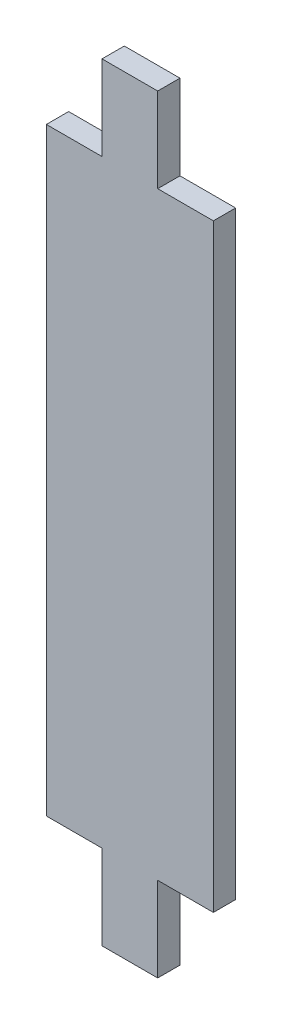
ISO-10303-21;
HEADER;
FILE_DESCRIPTION(('STEP AP214'),'2;1');
FILE_NAME('part.step','',(''),(''),'','','');
FILE_SCHEMA(('AUTOMOTIVE_DESIGN { 1 0 10303 214 1 1 1 1 }'));
ENDSEC;
DATA;
#1=APPLICATION_CONTEXT('core data for automotive mechanical design processes');
#2=APPLICATION_PROTOCOL_DEFINITION('international standard','automotive_design',2000,#1);
#3=PRODUCT_CONTEXT('',#1,'mechanical');
#4=PRODUCT('Part','Part','',(#3));
#5=PRODUCT_RELATED_PRODUCT_CATEGORY('part','',(#4));
#6=PRODUCT_DEFINITION_FORMATION('','',#4);
#7=PRODUCT_DEFINITION_CONTEXT('part definition',#1,'design');
#8=PRODUCT_DEFINITION('design','',#6,#7);
#9=PRODUCT_DEFINITION_SHAPE('','',#8);
#10=(LENGTH_UNIT() NAMED_UNIT(*) SI_UNIT(.MILLI.,.METRE.));
#11=(NAMED_UNIT(*) PLANE_ANGLE_UNIT() SI_UNIT($,.RADIAN.));
#12=(NAMED_UNIT(*) SI_UNIT($,.STERADIAN.) SOLID_ANGLE_UNIT());
#13=UNCERTAINTY_MEASURE_WITH_UNIT(LENGTH_MEASURE(1.E-05),#10,'distance_accuracy_value','');
#14=(GEOMETRIC_REPRESENTATION_CONTEXT(3) GLOBAL_UNCERTAINTY_ASSIGNED_CONTEXT((#13)) GLOBAL_UNIT_ASSIGNED_CONTEXT((#10,
#11,#12)) REPRESENTATION_CONTEXT('',''));
#15=CARTESIAN_POINT('',(0.,0.,0.));
#16=DIRECTION('',(0.,0.,1.));
#17=DIRECTION('',(1.,0.,0.));
#18=AXIS2_PLACEMENT_3D('',#15,#16,#17);
#19=CARTESIAN_POINT('',(-10.7098765432098,69.,0.));
#20=DIRECTION('',(1.,0.,0.));
#21=DIRECTION('',(0.,0.,-1.));
#22=AXIS2_PLACEMENT_3D('',#19,#20,#21);
#23=PLANE('',#22);
#24=DIRECTION('',(0.,-1.,0.));
#25=VECTOR('',#24,1.);
#26=CARTESIAN_POINT('',(-10.7098765432098,69.,0.));
#27=LINE('',#26,#25);
#28=CARTESIAN_POINT('',(-10.7098765432098,61.4,0.));
#29=VERTEX_POINT('',#28);
#30=CARTESIAN_POINT('',(-10.7098765432098,7.6,0.));
#31=VERTEX_POINT('',#30);
#32=EDGE_CURVE('E143',#29,#31,#27,.T.);
#33=ORIENTED_EDGE('',*,*,#32,.T.);
#34=DIRECTION('',(0.,0.,-1.));
#35=VECTOR('',#34,1.);
#36=CARTESIAN_POINT('',(-10.7098765432098,7.6,69.));
#37=LINE('',#36,#35);
#38=CARTESIAN_POINT('',(-10.7098765432098,7.6,2.));
#39=VERTEX_POINT('',#38);
#40=EDGE_CURVE('E123',#39,#31,#37,.T.);
#41=ORIENTED_EDGE('',*,*,#40,.F.);
#42=DIRECTION('',(0.,-1.,0.));
#43=VECTOR('',#42,1.);
#44=CARTESIAN_POINT('',(-10.7098765432098,69.,2.));
#45=LINE('',#44,#43);
#46=CARTESIAN_POINT('',(-10.7098765432098,61.4,2.));
#47=VERTEX_POINT('',#46);
#48=EDGE_CURVE('E160',#47,#39,#45,.T.);
#49=ORIENTED_EDGE('',*,*,#48,.F.);
#50=DIRECTION('',(0.,0.,-1.));
#51=VECTOR('',#50,1.);
#52=CARTESIAN_POINT('',(-10.7098765432098,61.4,69.));
#53=LINE('',#52,#51);
#54=EDGE_CURVE('E144',#47,#29,#53,.T.);
#55=ORIENTED_EDGE('',*,*,#54,.T.);
#56=EDGE_LOOP('',(#33,#41,#49,#55));
#57=FACE_BOUND('',#56,.T.);
#58=ADVANCED_FACE('F35',(#57),#23,.F.);
#59=CARTESIAN_POINT('',(-10.7098765432098,69.,2.));
#60=DIRECTION('',(0.,0.,-1.));
#61=DIRECTION('',(-1.,0.,0.));
#62=AXIS2_PLACEMENT_3D('',#59,#60,#61);
#63=PLANE('',#62);
#64=DIRECTION('',(1.,0.,0.));
#65=VECTOR('',#64,1.);
#66=CARTESIAN_POINT('',(-10.7098765432098,7.6,2.));
#67=LINE('',#66,#65);
#68=CARTESIAN_POINT('',(-5.70987654320979,7.6,2.));
#69=VERTEX_POINT('',#68);
#70=EDGE_CURVE('E130',#39,#69,#67,.T.);
#71=ORIENTED_EDGE('',*,*,#70,.T.);
#72=DIRECTION('',(0.,-1.,0.));
#73=VECTOR('',#72,1.);
#74=CARTESIAN_POINT('',(-5.70987654320979,69.,2.));
#75=LINE('',#74,#73);
#76=CARTESIAN_POINT('',(-5.70987654320979,0.,2.));
#77=VERTEX_POINT('',#76);
#78=EDGE_CURVE('E180',#69,#77,#75,.T.);
#79=ORIENTED_EDGE('',*,*,#78,.T.);
#80=DIRECTION('',(1.,0.,0.));
#81=VECTOR('',#80,1.);
#82=CARTESIAN_POINT('',(-10.7098765432098,0.,2.));
#83=LINE('',#82,#81);
#84=CARTESIAN_POINT('',(-0.709876543209793,0.,2.));
#85=VERTEX_POINT('',#84);
#86=EDGE_CURVE('E184',#77,#85,#83,.T.);
#87=ORIENTED_EDGE('',*,*,#86,.T.);
#88=DIRECTION('',(0.,1.,0.));
#89=VECTOR('',#88,1.);
#90=CARTESIAN_POINT('',(-0.709876543209793,69.,2.));
#91=LINE('',#90,#89);
#92=CARTESIAN_POINT('',(-0.709876543209793,7.6,2.));
#93=VERTEX_POINT('',#92);
#94=EDGE_CURVE('E193',#85,#93,#91,.T.);
#95=ORIENTED_EDGE('',*,*,#94,.T.);
#96=DIRECTION('',(1.,0.,0.));
#97=VECTOR('',#96,1.);
#98=CARTESIAN_POINT('',(-10.7098765432098,7.6,2.));
#99=LINE('',#98,#97);
#100=CARTESIAN_POINT('',(4.29012345679021,7.6,2.));
#101=VERTEX_POINT('',#100);
#102=EDGE_CURVE('E186',#93,#101,#99,.T.);
#103=ORIENTED_EDGE('',*,*,#102,.T.);
#104=DIRECTION('',(0.,-1.,0.));
#105=VECTOR('',#104,1.);
#106=CARTESIAN_POINT('',(4.29012345679021,69.,2.));
#107=LINE('',#106,#105);
#108=CARTESIAN_POINT('',(4.29012345679021,61.4,2.));
#109=VERTEX_POINT('',#108);
#110=EDGE_CURVE('E150',#109,#101,#107,.T.);
#111=ORIENTED_EDGE('',*,*,#110,.F.);
#112=DIRECTION('',(-1.,0.,0.));
#113=VECTOR('',#112,1.);
#114=CARTESIAN_POINT('',(-10.7098765432098,61.4,2.));
#115=LINE('',#114,#113);
#116=CARTESIAN_POINT('',(-0.709876543209793,61.4,2.));
#117=VERTEX_POINT('',#116);
#118=EDGE_CURVE('E179',#109,#117,#115,.T.);
#119=ORIENTED_EDGE('',*,*,#118,.T.);
#120=DIRECTION('',(0.,1.,0.));
#121=VECTOR('',#120,1.);
#122=CARTESIAN_POINT('',(-0.709876543209793,69.,2.));
#123=LINE('',#122,#121);
#124=CARTESIAN_POINT('',(-0.709876543209793,69.,2.));
#125=VERTEX_POINT('',#124);
#126=EDGE_CURVE('E169',#117,#125,#123,.T.);
#127=ORIENTED_EDGE('',*,*,#126,.T.);
#128=DIRECTION('',(1.,0.,0.));
#129=VECTOR('',#128,1.);
#130=CARTESIAN_POINT('',(-10.7098765432098,69.,2.));
#131=LINE('',#130,#129);
#132=CARTESIAN_POINT('',(-5.70987654320979,69.,2.));
#133=VERTEX_POINT('',#132);
#134=EDGE_CURVE('E153',#133,#125,#131,.T.);
#135=ORIENTED_EDGE('',*,*,#134,.F.);
#136=DIRECTION('',(0.,-1.,0.));
#137=VECTOR('',#136,1.);
#138=CARTESIAN_POINT('',(-5.70987654320979,69.,2.));
#139=LINE('',#138,#137);
#140=CARTESIAN_POINT('',(-5.70987654320979,61.4,2.));
#141=VERTEX_POINT('',#140);
#142=EDGE_CURVE('E56',#133,#141,#139,.T.);
#143=ORIENTED_EDGE('',*,*,#142,.T.);
#144=DIRECTION('',(-1.,0.,0.));
#145=VECTOR('',#144,1.);
#146=CARTESIAN_POINT('',(-10.7098765432098,61.4,2.));
#147=LINE('',#146,#145);
#148=EDGE_CURVE('E207',#141,#47,#147,.T.);
#149=ORIENTED_EDGE('',*,*,#148,.T.);
#150=ORIENTED_EDGE('',*,*,#48,.T.);
#151=EDGE_LOOP('',(#71,#79,#87,#95,#103,#111,#119,#127,#135,#143,#149,#150));
#152=FACE_BOUND('',#151,.T.);
#153=ADVANCED_FACE('F177',(#152),#63,.F.);
#154=CARTESIAN_POINT('',(4.29012345679021,69.,0.));
#155=DIRECTION('',(-1.,0.,0.));
#156=DIRECTION('',(0.,0.,1.));
#157=AXIS2_PLACEMENT_3D('',#154,#155,#156);
#158=PLANE('',#157);
#159=DIRECTION('',(0.,-1.,0.));
#160=VECTOR('',#159,1.);
#161=CARTESIAN_POINT('',(4.29012345679021,69.,0.));
#162=LINE('',#161,#160);
#163=CARTESIAN_POINT('',(4.29012345679021,61.4,0.));
#164=VERTEX_POINT('',#163);
#165=CARTESIAN_POINT('',(4.29012345679021,7.6,0.));
#166=VERTEX_POINT('',#165);
#167=EDGE_CURVE('E147',#164,#166,#162,.T.);
#168=ORIENTED_EDGE('',*,*,#167,.F.);
#169=DIRECTION('',(0.,0.,-1.));
#170=VECTOR('',#169,1.);
#171=CARTESIAN_POINT('',(4.29012345679021,61.4,69.));
#172=LINE('',#171,#170);
#173=EDGE_CURVE('E213',#109,#164,#172,.T.);
#174=ORIENTED_EDGE('',*,*,#173,.F.);
#175=ORIENTED_EDGE('',*,*,#110,.T.);
#176=DIRECTION('',(0.,0.,-1.));
#177=VECTOR('',#176,1.);
#178=CARTESIAN_POINT('',(4.29012345679021,7.6,69.));
#179=LINE('',#178,#177);
#180=EDGE_CURVE('E194',#101,#166,#179,.T.);
#181=ORIENTED_EDGE('',*,*,#180,.T.);
#182=EDGE_LOOP('',(#168,#174,#175,#181));
#183=FACE_BOUND('',#182,.T.);
#184=ADVANCED_FACE('F245',(#183),#158,.F.);
#185=CARTESIAN_POINT('',(-10.7098765432098,69.,0.));
#186=DIRECTION('',(0.,0.,1.));
#187=DIRECTION('',(1.,0.,0.));
#188=AXIS2_PLACEMENT_3D('',#185,#186,#187);
#189=PLANE('',#188);
#190=DIRECTION('',(-1.,0.,0.));
#191=VECTOR('',#190,1.);
#192=CARTESIAN_POINT('',(-10.7098765432098,0.,0.));
#193=LINE('',#192,#191);
#194=CARTESIAN_POINT('',(-0.709876543209793,0.,0.));
#195=VERTEX_POINT('',#194);
#196=CARTESIAN_POINT('',(-5.70987654320979,0.,0.));
#197=VERTEX_POINT('',#196);
#198=EDGE_CURVE('E156',#195,#197,#193,.T.);
#199=ORIENTED_EDGE('',*,*,#198,.T.);
#200=DIRECTION('',(0.,-1.,0.));
#201=VECTOR('',#200,1.);
#202=CARTESIAN_POINT('',(-5.70987654320979,0.,0.));
#203=LINE('',#202,#201);
#204=CARTESIAN_POINT('',(-5.70987654320979,7.6,0.));
#205=VERTEX_POINT('',#204);
#206=EDGE_CURVE('E136',#205,#197,#203,.T.);
#207=ORIENTED_EDGE('',*,*,#206,.F.);
#208=DIRECTION('',(1.,0.,0.));
#209=VECTOR('',#208,1.);
#210=CARTESIAN_POINT('',(-10.7098765432098,7.6,0.));
#211=LINE('',#210,#209);
#212=EDGE_CURVE('E127',#31,#205,#211,.T.);
#213=ORIENTED_EDGE('',*,*,#212,.F.);
#214=ORIENTED_EDGE('',*,*,#32,.F.);
#215=DIRECTION('',(-1.,0.,0.));
#216=VECTOR('',#215,1.);
#217=CARTESIAN_POINT('',(-10.7098765432098,61.4,0.));
#218=LINE('',#217,#216);
#219=CARTESIAN_POINT('',(-5.70987654320979,61.4,0.));
#220=VERTEX_POINT('',#219);
#221=EDGE_CURVE('E224',#220,#29,#218,.T.);
#222=ORIENTED_EDGE('',*,*,#221,.F.);
#223=DIRECTION('',(0.,-1.,0.));
#224=VECTOR('',#223,1.);
#225=CARTESIAN_POINT('',(-5.70987654320979,69.,0.));
#226=LINE('',#225,#224);
#227=CARTESIAN_POINT('',(-5.70987654320979,69.,0.));
#228=VERTEX_POINT('',#227);
#229=EDGE_CURVE('E217',#228,#220,#226,.T.);
#230=ORIENTED_EDGE('',*,*,#229,.F.);
#231=DIRECTION('',(-1.,0.,0.));
#232=VECTOR('',#231,1.);
#233=CARTESIAN_POINT('',(-10.7098765432098,69.,0.));
#234=LINE('',#233,#232);
#235=CARTESIAN_POINT('',(-0.709876543209793,69.,0.));
#236=VERTEX_POINT('',#235);
#237=EDGE_CURVE('E148',#236,#228,#234,.T.);
#238=ORIENTED_EDGE('',*,*,#237,.F.);
#239=DIRECTION('',(0.,1.,0.));
#240=VECTOR('',#239,1.);
#241=CARTESIAN_POINT('',(-0.709876543209793,69.,0.));
#242=LINE('',#241,#240);
#243=CARTESIAN_POINT('',(-0.709876543209793,61.4,0.));
#244=VERTEX_POINT('',#243);
#245=EDGE_CURVE('E49',#244,#236,#242,.T.);
#246=ORIENTED_EDGE('',*,*,#245,.F.);
#247=DIRECTION('',(-1.,0.,0.));
#248=VECTOR('',#247,1.);
#249=CARTESIAN_POINT('',(4.29012345679021,61.4,0.));
#250=LINE('',#249,#248);
#251=EDGE_CURVE('E219',#164,#244,#250,.T.);
#252=ORIENTED_EDGE('',*,*,#251,.F.);
#253=ORIENTED_EDGE('',*,*,#167,.T.);
#254=DIRECTION('',(1.,0.,0.));
#255=VECTOR('',#254,1.);
#256=CARTESIAN_POINT('',(4.29012345679021,7.6,0.));
#257=LINE('',#256,#255);
#258=CARTESIAN_POINT('',(-0.709876543209793,7.6,0.));
#259=VERTEX_POINT('',#258);
#260=EDGE_CURVE('E199',#259,#166,#257,.T.);
#261=ORIENTED_EDGE('',*,*,#260,.F.);
#262=DIRECTION('',(0.,1.,0.));
#263=VECTOR('',#262,1.);
#264=CARTESIAN_POINT('',(-0.709876543209793,0.,0.));
#265=LINE('',#264,#263);
#266=EDGE_CURVE('E203',#195,#259,#265,.T.);
#267=ORIENTED_EDGE('',*,*,#266,.F.);
#268=EDGE_LOOP('',(#199,#207,#213,#214,#222,#230,#238,#246,#252,#253,#261,#267));
#269=FACE_BOUND('',#268,.T.);
#270=ADVANCED_FACE('F141',(#269),#189,.F.);
#271=CARTESIAN_POINT('',(0.,69.,0.));
#272=DIRECTION('',(0.,1.,0.));
#273=DIRECTION('',(0.,0.,1.));
#274=AXIS2_PLACEMENT_3D('',#271,#272,#273);
#275=PLANE('',#274);
#276=DIRECTION('',(0.,0.,-1.));
#277=VECTOR('',#276,1.);
#278=CARTESIAN_POINT('',(-5.70987654320979,69.,0.));
#279=LINE('',#278,#277);
#280=EDGE_CURVE('E11',#133,#228,#279,.T.);
#281=ORIENTED_EDGE('',*,*,#280,.F.);
#282=ORIENTED_EDGE('',*,*,#134,.T.);
#283=DIRECTION('',(0.,0.,1.));
#284=VECTOR('',#283,1.);
#285=CARTESIAN_POINT('',(-0.709876543209793,69.,0.));
#286=LINE('',#285,#284);
#287=EDGE_CURVE('E42',#236,#125,#286,.T.);
#288=ORIENTED_EDGE('',*,*,#287,.F.);
#289=ORIENTED_EDGE('',*,*,#237,.T.);
#290=EDGE_LOOP('',(#281,#282,#288,#289));
#291=FACE_BOUND('',#290,.T.);
#292=ADVANCED_FACE('F182',(#291),#275,.T.);
#293=CARTESIAN_POINT('',(0.,0.,0.));
#294=DIRECTION('',(0.,1.,0.));
#295=DIRECTION('',(0.,0.,1.));
#296=AXIS2_PLACEMENT_3D('',#293,#294,#295);
#297=PLANE('',#296);
#298=ORIENTED_EDGE('',*,*,#86,.F.);
#299=DIRECTION('',(0.,0.,-1.));
#300=VECTOR('',#299,1.);
#301=CARTESIAN_POINT('',(-5.70987654320979,0.,0.));
#302=LINE('',#301,#300);
#303=EDGE_CURVE('E165',#77,#197,#302,.T.);
#304=ORIENTED_EDGE('',*,*,#303,.T.);
#305=ORIENTED_EDGE('',*,*,#198,.F.);
#306=DIRECTION('',(0.,0.,1.));
#307=VECTOR('',#306,1.);
#308=CARTESIAN_POINT('',(-0.709876543209793,0.,0.));
#309=LINE('',#308,#307);
#310=EDGE_CURVE('E162',#195,#85,#309,.T.);
#311=ORIENTED_EDGE('',*,*,#310,.T.);
#312=EDGE_LOOP('',(#298,#304,#305,#311));
#313=FACE_BOUND('',#312,.T.);
#314=ADVANCED_FACE('F234',(#313),#297,.F.);
#315=CARTESIAN_POINT('',(4.29012345679021,7.6,69.));
#316=DIRECTION('',(0.,1.,0.));
#317=DIRECTION('',(0.,0.,1.));
#318=AXIS2_PLACEMENT_3D('',#315,#316,#317);
#319=PLANE('',#318);
#320=DIRECTION('',(0.,0.,-1.));
#321=VECTOR('',#320,1.);
#322=CARTESIAN_POINT('',(-0.709876543209793,7.6,69.));
#323=LINE('',#322,#321);
#324=EDGE_CURVE('E196',#93,#259,#323,.T.);
#325=ORIENTED_EDGE('',*,*,#324,.T.);
#326=ORIENTED_EDGE('',*,*,#260,.T.);
#327=ORIENTED_EDGE('',*,*,#180,.F.);
#328=ORIENTED_EDGE('',*,*,#102,.F.);
#329=EDGE_LOOP('',(#325,#326,#327,#328));
#330=FACE_BOUND('',#329,.T.);
#331=ADVANCED_FACE('F241',(#330),#319,.F.);
#332=CARTESIAN_POINT('',(-0.709876543209793,0.,69.));
#333=DIRECTION('',(-1.,0.,0.));
#334=DIRECTION('',(0.,0.,1.));
#335=AXIS2_PLACEMENT_3D('',#332,#333,#334);
#336=PLANE('',#335);
#337=ORIENTED_EDGE('',*,*,#310,.F.);
#338=ORIENTED_EDGE('',*,*,#266,.T.);
#339=ORIENTED_EDGE('',*,*,#324,.F.);
#340=ORIENTED_EDGE('',*,*,#94,.F.);
#341=EDGE_LOOP('',(#337,#338,#339,#340));
#342=FACE_BOUND('',#341,.T.);
#343=ADVANCED_FACE('F239',(#342),#336,.F.);
#344=CARTESIAN_POINT('',(-10.7098765432098,7.6,69.));
#345=DIRECTION('',(0.,1.,0.));
#346=DIRECTION('',(-1.,0.,0.));
#347=AXIS2_PLACEMENT_3D('',#344,#345,#346);
#348=PLANE('',#347);
#349=ORIENTED_EDGE('',*,*,#40,.T.);
#350=ORIENTED_EDGE('',*,*,#212,.T.);
#351=DIRECTION('',(0.,0.,-1.));
#352=VECTOR('',#351,1.);
#353=CARTESIAN_POINT('',(-5.70987654320979,7.6,69.));
#354=LINE('',#353,#352);
#355=EDGE_CURVE('E135',#69,#205,#354,.T.);
#356=ORIENTED_EDGE('',*,*,#355,.F.);
#357=ORIENTED_EDGE('',*,*,#70,.F.);
#358=EDGE_LOOP('',(#349,#350,#356,#357));
#359=FACE_BOUND('',#358,.T.);
#360=ADVANCED_FACE('F125',(#359),#348,.F.);
#361=CARTESIAN_POINT('',(-5.70987654320979,0.,69.));
#362=DIRECTION('',(1.,0.,0.));
#363=DIRECTION('',(0.,0.,-1.));
#364=AXIS2_PLACEMENT_3D('',#361,#362,#363);
#365=PLANE('',#364);
#366=ORIENTED_EDGE('',*,*,#355,.T.);
#367=ORIENTED_EDGE('',*,*,#206,.T.);
#368=ORIENTED_EDGE('',*,*,#303,.F.);
#369=ORIENTED_EDGE('',*,*,#78,.F.);
#370=EDGE_LOOP('',(#366,#367,#368,#369));
#371=FACE_BOUND('',#370,.T.);
#372=ADVANCED_FACE('F231',(#371),#365,.F.);
#373=CARTESIAN_POINT('',(4.29012345679021,61.4,69.));
#374=DIRECTION('',(0.,-1.,0.));
#375=DIRECTION('',(0.,0.,-1.));
#376=AXIS2_PLACEMENT_3D('',#373,#374,#375);
#377=PLANE('',#376);
#378=ORIENTED_EDGE('',*,*,#173,.T.);
#379=ORIENTED_EDGE('',*,*,#251,.T.);
#380=DIRECTION('',(0.,0.,-1.));
#381=VECTOR('',#380,1.);
#382=CARTESIAN_POINT('',(-0.709876543209793,61.4,69.));
#383=LINE('',#382,#381);
#384=EDGE_CURVE('E215',#117,#244,#383,.T.);
#385=ORIENTED_EDGE('',*,*,#384,.F.);
#386=ORIENTED_EDGE('',*,*,#118,.F.);
#387=EDGE_LOOP('',(#378,#379,#385,#386));
#388=FACE_BOUND('',#387,.T.);
#389=ADVANCED_FACE('F249',(#388),#377,.F.);
#390=CARTESIAN_POINT('',(-0.709876543209793,69.,69.));
#391=DIRECTION('',(-1.,0.,0.));
#392=DIRECTION('',(0.,0.,1.));
#393=AXIS2_PLACEMENT_3D('',#390,#391,#392);
#394=PLANE('',#393);
#395=ORIENTED_EDGE('',*,*,#384,.T.);
#396=ORIENTED_EDGE('',*,*,#245,.T.);
#397=ORIENTED_EDGE('',*,*,#287,.T.);
#398=ORIENTED_EDGE('',*,*,#126,.F.);
#399=EDGE_LOOP('',(#395,#396,#397,#398));
#400=FACE_BOUND('',#399,.T.);
#401=ADVANCED_FACE('F168',(#400),#394,.F.);
#402=CARTESIAN_POINT('',(-10.7098765432098,61.4,69.));
#403=DIRECTION('',(0.,-1.,0.));
#404=DIRECTION('',(0.,0.,-1.));
#405=AXIS2_PLACEMENT_3D('',#402,#403,#404);
#406=PLANE('',#405);
#407=DIRECTION('',(0.,0.,-1.));
#408=VECTOR('',#407,1.);
#409=CARTESIAN_POINT('',(-5.70987654320979,61.4,69.));
#410=LINE('',#409,#408);
#411=EDGE_CURVE('E222',#141,#220,#410,.T.);
#412=ORIENTED_EDGE('',*,*,#411,.T.);
#413=ORIENTED_EDGE('',*,*,#221,.T.);
#414=ORIENTED_EDGE('',*,*,#54,.F.);
#415=ORIENTED_EDGE('',*,*,#148,.F.);
#416=EDGE_LOOP('',(#412,#413,#414,#415));
#417=FACE_BOUND('',#416,.T.);
#418=ADVANCED_FACE('F253',(#417),#406,.F.);
#419=CARTESIAN_POINT('',(-5.70987654320979,69.,69.));
#420=DIRECTION('',(1.,0.,0.));
#421=DIRECTION('',(0.,0.,-1.));
#422=AXIS2_PLACEMENT_3D('',#419,#420,#421);
#423=PLANE('',#422);
#424=ORIENTED_EDGE('',*,*,#280,.T.);
#425=ORIENTED_EDGE('',*,*,#229,.T.);
#426=ORIENTED_EDGE('',*,*,#411,.F.);
#427=ORIENTED_EDGE('',*,*,#142,.F.);
#428=EDGE_LOOP('',(#424,#425,#426,#427));
#429=FACE_BOUND('',#428,.T.);
#430=ADVANCED_FACE('F251',(#429),#423,.F.);
#431=CLOSED_SHELL('',(#58,#153,#184,#270,#292,#314,#331,#343,#360,#372,#389,#401,#418,#430));
#432=MANIFOLD_SOLID_BREP('B2',#431);
#433=ADVANCED_BREP_SHAPE_REPRESENTATION('',(#18,#432),#14);
#434=SHAPE_DEFINITION_REPRESENTATION(#9,#433);
ENDSEC;
END-ISO-10303-21;
